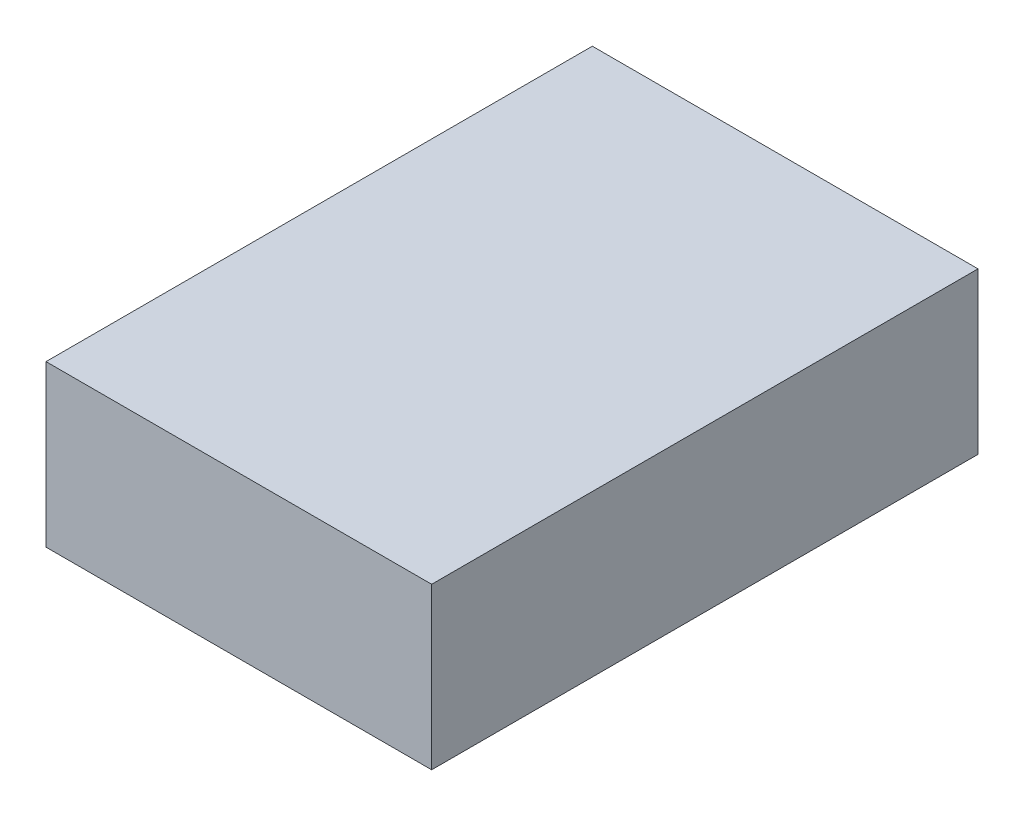
ISO-10303-21;
HEADER;
FILE_DESCRIPTION(('STEP AP214'),'2;1');
FILE_NAME('part.step','',(''),(''),'','','');
FILE_SCHEMA(('AUTOMOTIVE_DESIGN { 1 0 10303 214 1 1 1 1 }'));
ENDSEC;
DATA;
#1=APPLICATION_CONTEXT('core data for automotive mechanical design processes');
#2=APPLICATION_PROTOCOL_DEFINITION('international standard','automotive_design',2000,#1);
#3=PRODUCT_CONTEXT('',#1,'mechanical');
#4=PRODUCT('Part','Part','',(#3));
#5=PRODUCT_RELATED_PRODUCT_CATEGORY('part','',(#4));
#6=PRODUCT_DEFINITION_FORMATION('','',#4);
#7=PRODUCT_DEFINITION_CONTEXT('part definition',#1,'design');
#8=PRODUCT_DEFINITION('design','',#6,#7);
#9=PRODUCT_DEFINITION_SHAPE('','',#8);
#10=(LENGTH_UNIT() NAMED_UNIT(*) SI_UNIT(.MILLI.,.METRE.));
#11=(NAMED_UNIT(*) PLANE_ANGLE_UNIT() SI_UNIT($,.RADIAN.));
#12=(NAMED_UNIT(*) SI_UNIT($,.STERADIAN.) SOLID_ANGLE_UNIT());
#13=UNCERTAINTY_MEASURE_WITH_UNIT(LENGTH_MEASURE(1.E-05),#10,'distance_accuracy_value','');
#14=(GEOMETRIC_REPRESENTATION_CONTEXT(3) GLOBAL_UNCERTAINTY_ASSIGNED_CONTEXT((#13)) GLOBAL_UNIT_ASSIGNED_CONTEXT((#10,
#11,#12)) REPRESENTATION_CONTEXT('',''));
#15=CARTESIAN_POINT('',(0.,0.,0.));
#16=DIRECTION('',(0.,0.,1.));
#17=DIRECTION('',(1.,0.,0.));
#18=AXIS2_PLACEMENT_3D('',#15,#16,#17);
#19=CARTESIAN_POINT('',(-12.,10.,-17.));
#20=DIRECTION('',(1.,0.,0.));
#21=DIRECTION('',(0.,0.,-1.));
#22=AXIS2_PLACEMENT_3D('',#19,#20,#21);
#23=PLANE('',#22);
#24=DIRECTION('',(0.,0.,1.));
#25=VECTOR('',#24,1.);
#26=CARTESIAN_POINT('',(-12.,0.,-17.));
#27=LINE('',#26,#25);
#28=CARTESIAN_POINT('',(-12.,0.,-17.));
#29=VERTEX_POINT('',#28);
#30=CARTESIAN_POINT('',(-12.,0.,17.));
#31=VERTEX_POINT('',#30);
#32=EDGE_CURVE('E105',#29,#31,#27,.T.);
#33=ORIENTED_EDGE('',*,*,#32,.T.);
#34=DIRECTION('',(0.,-1.,0.));
#35=VECTOR('',#34,1.);
#36=CARTESIAN_POINT('',(-12.,10.,17.));
#37=LINE('',#36,#35);
#38=CARTESIAN_POINT('',(-12.,10.,17.));
#39=VERTEX_POINT('',#38);
#40=EDGE_CURVE('E11',#39,#31,#37,.T.);
#41=ORIENTED_EDGE('',*,*,#40,.F.);
#42=DIRECTION('',(0.,0.,1.));
#43=VECTOR('',#42,1.);
#44=CARTESIAN_POINT('',(-12.,10.,-17.));
#45=LINE('',#44,#43);
#46=CARTESIAN_POINT('',(-12.,10.,-17.));
#47=VERTEX_POINT('',#46);
#48=EDGE_CURVE('E89',#47,#39,#45,.T.);
#49=ORIENTED_EDGE('',*,*,#48,.F.);
#50=DIRECTION('',(0.,-1.,0.));
#51=VECTOR('',#50,1.);
#52=CARTESIAN_POINT('',(-12.,10.,-17.));
#53=LINE('',#52,#51);
#54=EDGE_CURVE('E98',#47,#29,#53,.T.);
#55=ORIENTED_EDGE('',*,*,#54,.T.);
#56=EDGE_LOOP('',(#33,#41,#49,#55));
#57=FACE_BOUND('',#56,.T.);
#58=ADVANCED_FACE('F39',(#57),#23,.F.);
#59=CARTESIAN_POINT('',(-12.,10.,17.));
#60=DIRECTION('',(0.,0.,-1.));
#61=DIRECTION('',(-1.,0.,0.));
#62=AXIS2_PLACEMENT_3D('',#59,#60,#61);
#63=PLANE('',#62);
#64=DIRECTION('',(1.,0.,0.));
#65=VECTOR('',#64,1.);
#66=CARTESIAN_POINT('',(-12.,0.,17.));
#67=LINE('',#66,#65);
#68=CARTESIAN_POINT('',(12.,0.,17.));
#69=VERTEX_POINT('',#68);
#70=EDGE_CURVE('E94',#31,#69,#67,.T.);
#71=ORIENTED_EDGE('',*,*,#70,.T.);
#72=DIRECTION('',(0.,-1.,0.));
#73=VECTOR('',#72,1.);
#74=CARTESIAN_POINT('',(12.,10.,17.));
#75=LINE('',#74,#73);
#76=CARTESIAN_POINT('',(12.,10.,17.));
#77=VERTEX_POINT('',#76);
#78=EDGE_CURVE('E50',#77,#69,#75,.T.);
#79=ORIENTED_EDGE('',*,*,#78,.F.);
#80=DIRECTION('',(1.,0.,0.));
#81=VECTOR('',#80,1.);
#82=CARTESIAN_POINT('',(-12.,10.,17.));
#83=LINE('',#82,#81);
#84=EDGE_CURVE('E83',#39,#77,#83,.T.);
#85=ORIENTED_EDGE('',*,*,#84,.F.);
#86=ORIENTED_EDGE('',*,*,#40,.T.);
#87=EDGE_LOOP('',(#71,#79,#85,#86));
#88=FACE_BOUND('',#87,.T.);
#89=ADVANCED_FACE('F91',(#88),#63,.F.);
#90=CARTESIAN_POINT('',(12.,10.,-17.));
#91=DIRECTION('',(-1.,0.,0.));
#92=DIRECTION('',(0.,0.,1.));
#93=AXIS2_PLACEMENT_3D('',#90,#91,#92);
#94=PLANE('',#93);
#95=DIRECTION('',(0.,0.,-1.));
#96=VECTOR('',#95,1.);
#97=CARTESIAN_POINT('',(12.,0.,-17.));
#98=LINE('',#97,#96);
#99=CARTESIAN_POINT('',(12.,0.,-17.));
#100=VERTEX_POINT('',#99);
#101=EDGE_CURVE('E75',#69,#100,#98,.T.);
#102=ORIENTED_EDGE('',*,*,#101,.T.);
#103=DIRECTION('',(0.,-1.,0.));
#104=VECTOR('',#103,1.);
#105=CARTESIAN_POINT('',(12.,10.,-17.));
#106=LINE('',#105,#104);
#107=CARTESIAN_POINT('',(12.,10.,-17.));
#108=VERTEX_POINT('',#107);
#109=EDGE_CURVE('E92',#108,#100,#106,.T.);
#110=ORIENTED_EDGE('',*,*,#109,.F.);
#111=DIRECTION('',(0.,0.,-1.));
#112=VECTOR('',#111,1.);
#113=CARTESIAN_POINT('',(12.,10.,-17.));
#114=LINE('',#113,#112);
#115=EDGE_CURVE('E86',#77,#108,#114,.T.);
#116=ORIENTED_EDGE('',*,*,#115,.F.);
#117=ORIENTED_EDGE('',*,*,#78,.T.);
#118=EDGE_LOOP('',(#102,#110,#116,#117));
#119=FACE_BOUND('',#118,.T.);
#120=ADVANCED_FACE('F96',(#119),#94,.F.);
#121=CARTESIAN_POINT('',(-12.,10.,-17.));
#122=DIRECTION('',(0.,0.,1.));
#123=DIRECTION('',(1.,0.,0.));
#124=AXIS2_PLACEMENT_3D('',#121,#122,#123);
#125=PLANE('',#124);
#126=DIRECTION('',(-1.,0.,0.));
#127=VECTOR('',#126,1.);
#128=CARTESIAN_POINT('',(-12.,0.,-17.));
#129=LINE('',#128,#127);
#130=EDGE_CURVE('E79',#100,#29,#129,.T.);
#131=ORIENTED_EDGE('',*,*,#130,.T.);
#132=ORIENTED_EDGE('',*,*,#54,.F.);
#133=DIRECTION('',(-1.,0.,0.));
#134=VECTOR('',#133,1.);
#135=CARTESIAN_POINT('',(-12.,10.,-17.));
#136=LINE('',#135,#134);
#137=EDGE_CURVE('E54',#108,#47,#136,.T.);
#138=ORIENTED_EDGE('',*,*,#137,.F.);
#139=ORIENTED_EDGE('',*,*,#109,.T.);
#140=EDGE_LOOP('',(#131,#132,#138,#139));
#141=FACE_BOUND('',#140,.T.);
#142=ADVANCED_FACE('F108',(#141),#125,.F.);
#143=CARTESIAN_POINT('',(0.,10.,0.));
#144=DIRECTION('',(0.,1.,0.));
#145=DIRECTION('',(0.,0.,1.));
#146=AXIS2_PLACEMENT_3D('',#143,#144,#145);
#147=PLANE('',#146);
#148=ORIENTED_EDGE('',*,*,#48,.T.);
#149=ORIENTED_EDGE('',*,*,#84,.T.);
#150=ORIENTED_EDGE('',*,*,#115,.T.);
#151=ORIENTED_EDGE('',*,*,#137,.T.);
#152=EDGE_LOOP('',(#148,#149,#150,#151));
#153=FACE_BOUND('',#152,.T.);
#154=ADVANCED_FACE('F88',(#153),#147,.T.);
#155=CARTESIAN_POINT('',(0.,0.,0.));
#156=DIRECTION('',(0.,1.,0.));
#157=DIRECTION('',(0.,0.,1.));
#158=AXIS2_PLACEMENT_3D('',#155,#156,#157);
#159=PLANE('',#158);
#160=ORIENTED_EDGE('',*,*,#32,.F.);
#161=ORIENTED_EDGE('',*,*,#130,.F.);
#162=ORIENTED_EDGE('',*,*,#101,.F.);
#163=ORIENTED_EDGE('',*,*,#70,.F.);
#164=EDGE_LOOP('',(#160,#161,#162,#163));
#165=FACE_BOUND('',#164,.T.);
#166=ADVANCED_FACE('F115',(#165),#159,.F.);
#167=CLOSED_SHELL('',(#58,#89,#120,#142,#154,#166));
#168=MANIFOLD_SOLID_BREP('B2',#167);
#169=ADVANCED_BREP_SHAPE_REPRESENTATION('',(#18,#168),#14);
#170=SHAPE_DEFINITION_REPRESENTATION(#9,#169);
ENDSEC;
END-ISO-10303-21;
